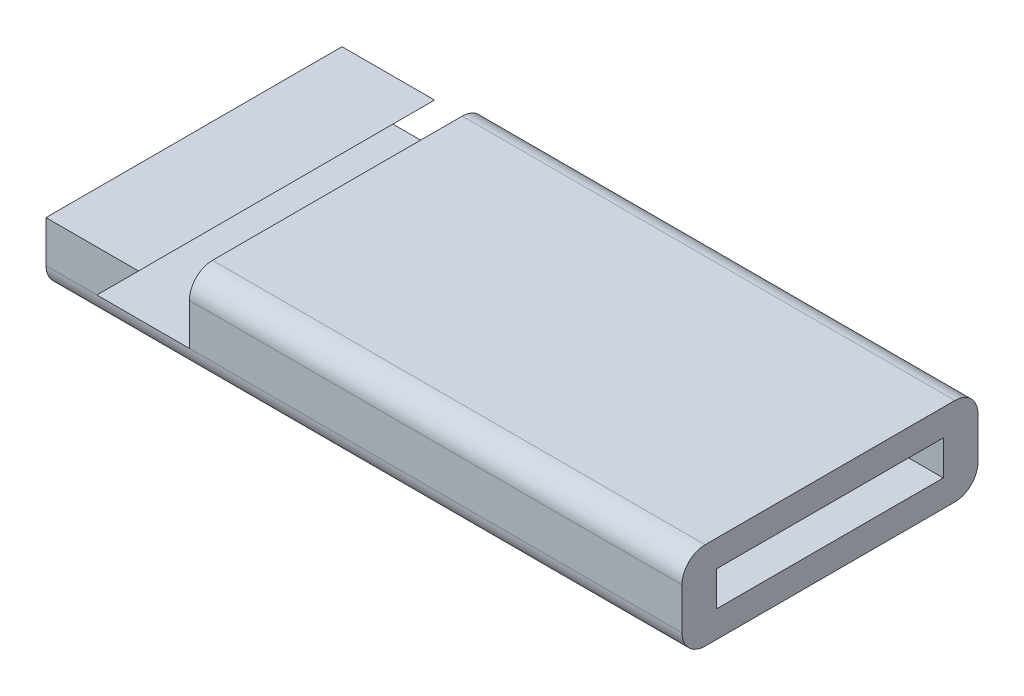
ISO-10303-21;
HEADER;
FILE_DESCRIPTION(('STEP AP214'),'2;1');
FILE_NAME('part.step','',(''),(''),'','','');
FILE_SCHEMA(('AUTOMOTIVE_DESIGN { 1 0 10303 214 1 1 1 1 }'));
ENDSEC;
DATA;
#1=APPLICATION_CONTEXT('core data for automotive mechanical design processes');
#2=APPLICATION_PROTOCOL_DEFINITION('international standard','automotive_design',2000,#1);
#3=PRODUCT_CONTEXT('',#1,'mechanical');
#4=PRODUCT('Part','Part','',(#3));
#5=PRODUCT_RELATED_PRODUCT_CATEGORY('part','',(#4));
#6=PRODUCT_DEFINITION_FORMATION('','',#4);
#7=PRODUCT_DEFINITION_CONTEXT('part definition',#1,'design');
#8=PRODUCT_DEFINITION('design','',#6,#7);
#9=PRODUCT_DEFINITION_SHAPE('','',#8);
#10=(LENGTH_UNIT() NAMED_UNIT(*) SI_UNIT(.MILLI.,.METRE.));
#11=(NAMED_UNIT(*) PLANE_ANGLE_UNIT() SI_UNIT($,.RADIAN.));
#12=(NAMED_UNIT(*) SI_UNIT($,.STERADIAN.) SOLID_ANGLE_UNIT());
#13=UNCERTAINTY_MEASURE_WITH_UNIT(LENGTH_MEASURE(1.E-05),#10,'distance_accuracy_value','');
#14=(GEOMETRIC_REPRESENTATION_CONTEXT(3) GLOBAL_UNCERTAINTY_ASSIGNED_CONTEXT((#13)) GLOBAL_UNIT_ASSIGNED_CONTEXT((#10,
#11,#12)) REPRESENTATION_CONTEXT('',''));
#15=CARTESIAN_POINT('',(0.,0.,0.));
#16=DIRECTION('',(0.,0.,1.));
#17=DIRECTION('',(1.,0.,0.));
#18=AXIS2_PLACEMENT_3D('',#15,#16,#17);
#19=CARTESIAN_POINT('',(0.,7.6,0.));
#20=DIRECTION('',(0.,0.,-1.));
#21=DIRECTION('',(-1.,0.,0.));
#22=AXIS2_PLACEMENT_3D('',#19,#20,#21);
#23=PLANE('',#22);
#24=DIRECTION('',(0.,-1.,0.));
#25=VECTOR('',#24,1.);
#26=CARTESIAN_POINT('',(0.,7.6,0.));
#27=LINE('',#26,#25);
#28=CARTESIAN_POINT('',(0.,5.6,0.));
#29=VERTEX_POINT('',#28);
#30=CARTESIAN_POINT('',(0.,2.,0.));
#31=VERTEX_POINT('',#30);
#32=EDGE_CURVE('E239',#29,#31,#27,.T.);
#33=ORIENTED_EDGE('',*,*,#32,.T.);
#34=DIRECTION('',(1.,0.,0.));
#35=VECTOR('',#34,1.);
#36=CARTESIAN_POINT('',(55.,2.,0.));
#37=LINE('',#36,#35);
#38=CARTESIAN_POINT('',(4.39999999999992,2.,0.));
#39=VERTEX_POINT('',#38);
#40=EDGE_CURVE('E269',#31,#39,#37,.T.);
#41=ORIENTED_EDGE('',*,*,#40,.T.);
#42=DIRECTION('',(-0.707106781186556,-0.707106781186539,0.));
#43=VECTOR('',#42,1.);
#44=CARTESIAN_POINT('',(1.1999999999999,-1.19999999999993,0.));
#45=LINE('',#44,#43);
#46=CARTESIAN_POINT('',(8.,5.6,0.));
#47=VERTEX_POINT('',#46);
#48=EDGE_CURVE('E193',#47,#39,#45,.T.);
#49=ORIENTED_EDGE('',*,*,#48,.F.);
#50=DIRECTION('',(1.,0.,0.));
#51=VECTOR('',#50,1.);
#52=CARTESIAN_POINT('',(0.,5.6,0.));
#53=LINE('',#52,#51);
#54=EDGE_CURVE('E196',#29,#47,#53,.T.);
#55=ORIENTED_EDGE('',*,*,#54,.F.);
#56=EDGE_LOOP('',(#33,#41,#49,#55));
#57=FACE_BOUND('',#56,.T.);
#58=ADVANCED_FACE('F37',(#57),#23,.F.);
#59=CARTESIAN_POINT('',(0.,7.6,-25.6));
#60=DIRECTION('',(0.,0.,1.));
#61=DIRECTION('',(1.,0.,0.));
#62=AXIS2_PLACEMENT_3D('',#59,#60,#61);
#63=PLANE('',#62);
#64=DIRECTION('',(0.,-1.,0.));
#65=VECTOR('',#64,1.);
#66=CARTESIAN_POINT('',(55.,7.6,-25.6));
#67=LINE('',#66,#65);
#68=CARTESIAN_POINT('',(55.,5.6,-25.6));
#69=VERTEX_POINT('',#68);
#70=CARTESIAN_POINT('',(55.,2.,-25.6));
#71=VERTEX_POINT('',#70);
#72=EDGE_CURVE('E233',#69,#71,#67,.T.);
#73=ORIENTED_EDGE('',*,*,#72,.T.);
#74=DIRECTION('',(-1.,0.,0.));
#75=VECTOR('',#74,1.);
#76=CARTESIAN_POINT('',(0.,2.,-25.6));
#77=LINE('',#76,#75);
#78=CARTESIAN_POINT('',(12.4,2.,-25.6));
#79=VERTEX_POINT('',#78);
#80=EDGE_CURVE('E246',#71,#79,#77,.T.);
#81=ORIENTED_EDGE('',*,*,#80,.T.);
#82=DIRECTION('',(0.,-1.,0.));
#83=VECTOR('',#82,1.);
#84=CARTESIAN_POINT('',(12.4,0.,-25.6));
#85=LINE('',#84,#83);
#86=CARTESIAN_POINT('',(12.4,5.6,-25.6));
#87=VERTEX_POINT('',#86);
#88=EDGE_CURVE('E184',#87,#79,#85,.T.);
#89=ORIENTED_EDGE('',*,*,#88,.F.);
#90=DIRECTION('',(-1.,0.,0.));
#91=VECTOR('',#90,1.);
#92=CARTESIAN_POINT('',(0.,5.6,-25.6));
#93=LINE('',#92,#91);
#94=EDGE_CURVE('E242',#87,#69,#93,.F.);
#95=ORIENTED_EDGE('',*,*,#94,.T.);
#96=EDGE_LOOP('',(#73,#81,#89,#95));
#97=FACE_BOUND('',#96,.T.);
#98=ADVANCED_FACE('F315',(#97),#63,.F.);
#99=CARTESIAN_POINT('',(0.,7.6,0.));
#100=DIRECTION('',(1.,0.,0.));
#101=DIRECTION('',(0.,0.,-1.));
#102=AXIS2_PLACEMENT_3D('',#99,#100,#101);
#103=PLANE('',#102);
#104=DIRECTION('',(0.,-1.,0.));
#105=VECTOR('',#104,1.);
#106=CARTESIAN_POINT('',(0.,7.6,-25.6));
#107=LINE('',#106,#105);
#108=CARTESIAN_POINT('',(0.,5.6,-25.6));
#109=VERTEX_POINT('',#108);
#110=CARTESIAN_POINT('',(0.,2.,-25.6));
#111=VERTEX_POINT('',#110);
#112=EDGE_CURVE('E225',#109,#111,#107,.T.);
#113=ORIENTED_EDGE('',*,*,#112,.T.);
#114=CARTESIAN_POINT('',(0.,2.,-23.6));
#115=DIRECTION('',(1.,0.,0.));
#116=DIRECTION('',(0.,0.,-1.));
#117=AXIS2_PLACEMENT_3D('',#114,#115,#116);
#118=CIRCLE('',#117,2.);
#119=CARTESIAN_POINT('',(0.,0.,-23.6));
#120=VERTEX_POINT('',#119);
#121=EDGE_CURVE('E251',#111,#120,#118,.F.);
#122=ORIENTED_EDGE('',*,*,#121,.T.);
#123=DIRECTION('',(0.,0.,1.));
#124=VECTOR('',#123,1.);
#125=CARTESIAN_POINT('',(0.,0.,0.));
#126=LINE('',#125,#124);
#127=CARTESIAN_POINT('',(0.,0.,-2.));
#128=VERTEX_POINT('',#127);
#129=EDGE_CURVE('E212',#120,#128,#126,.T.);
#130=ORIENTED_EDGE('',*,*,#129,.T.);
#131=CARTESIAN_POINT('',(0.,2.,-2.));
#132=DIRECTION('',(1.,0.,0.));
#133=DIRECTION('',(0.,0.,-1.));
#134=AXIS2_PLACEMENT_3D('',#131,#132,#133);
#135=CIRCLE('',#134,2.);
#136=EDGE_CURVE('E249',#128,#31,#135,.F.);
#137=ORIENTED_EDGE('',*,*,#136,.T.);
#138=ORIENTED_EDGE('',*,*,#32,.F.);
#139=DIRECTION('',(0.,0.,-1.));
#140=VECTOR('',#139,1.);
#141=CARTESIAN_POINT('',(0.,5.6,0.));
#142=LINE('',#141,#140);
#143=EDGE_CURVE('E209',#29,#109,#142,.T.);
#144=ORIENTED_EDGE('',*,*,#143,.T.);
#145=EDGE_LOOP('',(#113,#122,#130,#137,#138,#144));
#146=FACE_BOUND('',#145,.T.);
#147=ADVANCED_FACE('F330',(#146),#103,.F.);
#148=DIRECTION('',(0.,-1.,0.));
#149=VECTOR('',#148,1.);
#150=CARTESIAN_POINT('',(12.4,0.,0.));
#151=LINE('',#150,#149);
#152=CARTESIAN_POINT('',(12.4,5.6,0.));
#153=VERTEX_POINT('',#152);
#154=CARTESIAN_POINT('',(12.4,2.,0.));
#155=VERTEX_POINT('',#154);
#156=EDGE_CURVE('E188',#153,#155,#151,.T.);
#157=ORIENTED_EDGE('',*,*,#156,.T.);
#158=DIRECTION('',(1.,0.,0.));
#159=VECTOR('',#158,1.);
#160=CARTESIAN_POINT('',(55.,2.,0.));
#161=LINE('',#160,#159);
#162=CARTESIAN_POINT('',(55.,2.,0.));
#163=VERTEX_POINT('',#162);
#164=EDGE_CURVE('E267',#155,#163,#161,.T.);
#165=ORIENTED_EDGE('',*,*,#164,.T.);
#166=DIRECTION('',(0.,-1.,0.));
#167=VECTOR('',#166,1.);
#168=CARTESIAN_POINT('',(55.,7.6,0.));
#169=LINE('',#168,#167);
#170=CARTESIAN_POINT('',(55.,5.6,0.));
#171=VERTEX_POINT('',#170);
#172=EDGE_CURVE('E236',#171,#163,#169,.T.);
#173=ORIENTED_EDGE('',*,*,#172,.F.);
#174=DIRECTION('',(1.,0.,0.));
#175=VECTOR('',#174,1.);
#176=CARTESIAN_POINT('',(0.,5.6,0.));
#177=LINE('',#176,#175);
#178=EDGE_CURVE('E265',#171,#153,#177,.F.);
#179=ORIENTED_EDGE('',*,*,#178,.T.);
#180=EDGE_LOOP('',(#157,#165,#173,#179));
#181=FACE_BOUND('',#180,.T.);
#182=ADVANCED_FACE('F293',(#181),#23,.F.);
#183=DIRECTION('',(-0.707106781186556,-0.707106781186539,0.));
#184=VECTOR('',#183,1.);
#185=CARTESIAN_POINT('',(1.1999999999999,-1.19999999999993,-25.6));
#186=LINE('',#185,#184);
#187=CARTESIAN_POINT('',(8.,5.6,-25.6));
#188=VERTEX_POINT('',#187);
#189=CARTESIAN_POINT('',(4.39999999999992,2.,-25.6));
#190=VERTEX_POINT('',#189);
#191=EDGE_CURVE('E204',#188,#190,#186,.T.);
#192=ORIENTED_EDGE('',*,*,#191,.T.);
#193=DIRECTION('',(-1.,0.,0.));
#194=VECTOR('',#193,1.);
#195=CARTESIAN_POINT('',(0.,2.,-25.6));
#196=LINE('',#195,#194);
#197=EDGE_CURVE('E244',#190,#111,#196,.T.);
#198=ORIENTED_EDGE('',*,*,#197,.T.);
#199=ORIENTED_EDGE('',*,*,#112,.F.);
#200=DIRECTION('',(1.,0.,0.));
#201=VECTOR('',#200,1.);
#202=CARTESIAN_POINT('',(0.,5.6,-25.6));
#203=LINE('',#202,#201);
#204=EDGE_CURVE('E191',#109,#188,#203,.T.);
#205=ORIENTED_EDGE('',*,*,#204,.T.);
#206=EDGE_LOOP('',(#192,#198,#199,#205));
#207=FACE_BOUND('',#206,.T.);
#208=ADVANCED_FACE('F332',(#207),#63,.F.);
#209=CARTESIAN_POINT('',(55.,7.6,0.));
#210=DIRECTION('',(-1.,0.,0.));
#211=DIRECTION('',(0.,0.,1.));
#212=AXIS2_PLACEMENT_3D('',#209,#210,#211);
#213=PLANE('',#212);
#214=DIRECTION('',(0.,0.,-1.));
#215=VECTOR('',#214,1.);
#216=CARTESIAN_POINT('',(55.,2.3,-3.));
#217=LINE('',#216,#215);
#218=CARTESIAN_POINT('',(55.,2.3,-3.));
#219=VERTEX_POINT('',#218);
#220=CARTESIAN_POINT('',(55.,2.3,-22.6));
#221=VERTEX_POINT('',#220);
#222=EDGE_CURVE('E178',#219,#221,#217,.T.);
#223=ORIENTED_EDGE('',*,*,#222,.F.);
#224=DIRECTION('',(0.,-1.,0.));
#225=VECTOR('',#224,1.);
#226=CARTESIAN_POINT('',(55.,5.3,-3.));
#227=LINE('',#226,#225);
#228=CARTESIAN_POINT('',(55.,5.3,-3.));
#229=VERTEX_POINT('',#228);
#230=EDGE_CURVE('E52',#229,#219,#227,.T.);
#231=ORIENTED_EDGE('',*,*,#230,.F.);
#232=DIRECTION('',(0.,0.,1.));
#233=VECTOR('',#232,1.);
#234=CARTESIAN_POINT('',(55.,5.3,-3.));
#235=LINE('',#234,#233);
#236=CARTESIAN_POINT('',(55.,5.3,-22.6));
#237=VERTEX_POINT('',#236);
#238=EDGE_CURVE('E169',#237,#229,#235,.T.);
#239=ORIENTED_EDGE('',*,*,#238,.F.);
#240=DIRECTION('',(0.,1.,0.));
#241=VECTOR('',#240,1.);
#242=CARTESIAN_POINT('',(55.,5.3,-22.6));
#243=LINE('',#242,#241);
#244=EDGE_CURVE('E172',#221,#237,#243,.T.);
#245=ORIENTED_EDGE('',*,*,#244,.F.);
#246=EDGE_LOOP('',(#223,#231,#239,#245));
#247=FACE_BOUND('',#246,.T.);
#248=DIRECTION('',(0.,0.,-1.));
#249=VECTOR('',#248,1.);
#250=CARTESIAN_POINT('',(55.,0.,0.));
#251=LINE('',#250,#249);
#252=CARTESIAN_POINT('',(55.,0.,-2.));
#253=VERTEX_POINT('',#252);
#254=CARTESIAN_POINT('',(55.,0.,-23.6));
#255=VERTEX_POINT('',#254);
#256=EDGE_CURVE('E226',#253,#255,#251,.T.);
#257=ORIENTED_EDGE('',*,*,#256,.T.);
#258=CARTESIAN_POINT('',(55.,2.,-23.6));
#259=DIRECTION('',(-1.,0.,0.));
#260=DIRECTION('',(0.,0.,1.));
#261=AXIS2_PLACEMENT_3D('',#258,#259,#260);
#262=CIRCLE('',#261,2.);
#263=EDGE_CURVE('E263',#255,#71,#262,.F.);
#264=ORIENTED_EDGE('',*,*,#263,.T.);
#265=ORIENTED_EDGE('',*,*,#72,.F.);
#266=CARTESIAN_POINT('',(55.,5.6,-23.6));
#267=DIRECTION('',(-1.,0.,0.));
#268=DIRECTION('',(0.,0.,1.));
#269=AXIS2_PLACEMENT_3D('',#266,#267,#268);
#270=CIRCLE('',#269,2.);
#271=CARTESIAN_POINT('',(55.,7.6,-23.6));
#272=VERTEX_POINT('',#271);
#273=EDGE_CURVE('E259',#69,#272,#270,.F.);
#274=ORIENTED_EDGE('',*,*,#273,.T.);
#275=DIRECTION('',(0.,0.,-1.));
#276=VECTOR('',#275,1.);
#277=CARTESIAN_POINT('',(55.,7.6,0.));
#278=LINE('',#277,#276);
#279=CARTESIAN_POINT('',(55.,7.6,-2.));
#280=VERTEX_POINT('',#279);
#281=EDGE_CURVE('E222',#280,#272,#278,.T.);
#282=ORIENTED_EDGE('',*,*,#281,.F.);
#283=CARTESIAN_POINT('',(55.,5.6,-2.));
#284=DIRECTION('',(-1.,0.,0.));
#285=DIRECTION('',(0.,0.,1.));
#286=AXIS2_PLACEMENT_3D('',#283,#284,#285);
#287=CIRCLE('',#286,2.);
#288=EDGE_CURVE('E257',#280,#171,#287,.F.);
#289=ORIENTED_EDGE('',*,*,#288,.T.);
#290=ORIENTED_EDGE('',*,*,#172,.T.);
#291=CARTESIAN_POINT('',(55.,2.,-2.));
#292=DIRECTION('',(-1.,0.,0.));
#293=DIRECTION('',(0.,0.,1.));
#294=AXIS2_PLACEMENT_3D('',#291,#292,#293);
#295=CIRCLE('',#294,2.);
#296=EDGE_CURVE('E261',#163,#253,#295,.F.);
#297=ORIENTED_EDGE('',*,*,#296,.T.);
#298=EDGE_LOOP('',(#257,#264,#265,#274,#282,#289,#290,#297));
#299=FACE_BOUND('',#298,.T.);
#300=ADVANCED_FACE('F290',(#247,#299),#213,.F.);
#301=CARTESIAN_POINT('',(0.,7.6,0.));
#302=DIRECTION('',(0.,-1.,0.));
#303=DIRECTION('',(0.,0.,-1.));
#304=AXIS2_PLACEMENT_3D('',#301,#302,#303);
#305=PLANE('',#304);
#306=ORIENTED_EDGE('',*,*,#281,.T.);
#307=DIRECTION('',(-1.,0.,0.));
#308=VECTOR('',#307,1.);
#309=CARTESIAN_POINT('',(0.,7.6,-23.6));
#310=LINE('',#309,#308);
#311=CARTESIAN_POINT('',(12.4,7.6,-23.6));
#312=VERTEX_POINT('',#311);
#313=EDGE_CURVE('E275',#272,#312,#310,.T.);
#314=ORIENTED_EDGE('',*,*,#313,.T.);
#315=DIRECTION('',(0.,0.,-1.));
#316=VECTOR('',#315,1.);
#317=CARTESIAN_POINT('',(12.4,7.6,0.));
#318=LINE('',#317,#316);
#319=CARTESIAN_POINT('',(12.4,7.6,-2.));
#320=VERTEX_POINT('',#319);
#321=EDGE_CURVE('E198',#320,#312,#318,.T.);
#322=ORIENTED_EDGE('',*,*,#321,.F.);
#323=DIRECTION('',(1.,0.,0.));
#324=VECTOR('',#323,1.);
#325=CARTESIAN_POINT('',(0.,7.6,-2.));
#326=LINE('',#325,#324);
#327=EDGE_CURVE('E272',#320,#280,#326,.T.);
#328=ORIENTED_EDGE('',*,*,#327,.T.);
#329=EDGE_LOOP('',(#306,#314,#322,#328));
#330=FACE_BOUND('',#329,.T.);
#331=ADVANCED_FACE('F286',(#330),#305,.F.);
#332=CARTESIAN_POINT('',(0.,0.,0.));
#333=DIRECTION('',(0.,-1.,0.));
#334=DIRECTION('',(0.,0.,-1.));
#335=AXIS2_PLACEMENT_3D('',#332,#333,#334);
#336=PLANE('',#335);
#337=ORIENTED_EDGE('',*,*,#129,.F.);
#338=DIRECTION('',(-1.,0.,0.));
#339=VECTOR('',#338,1.);
#340=CARTESIAN_POINT('',(55.,0.,-23.6));
#341=LINE('',#340,#339);
#342=EDGE_CURVE('E255',#120,#255,#341,.F.);
#343=ORIENTED_EDGE('',*,*,#342,.T.);
#344=ORIENTED_EDGE('',*,*,#256,.F.);
#345=DIRECTION('',(1.,0.,0.));
#346=VECTOR('',#345,1.);
#347=CARTESIAN_POINT('',(0.,0.,-2.));
#348=LINE('',#347,#346);
#349=EDGE_CURVE('E253',#253,#128,#348,.F.);
#350=ORIENTED_EDGE('',*,*,#349,.T.);
#351=EDGE_LOOP('',(#337,#343,#344,#350));
#352=FACE_BOUND('',#351,.T.);
#353=ADVANCED_FACE('F305',(#352),#336,.T.);
#354=CARTESIAN_POINT('',(0.,5.6,0.));
#355=DIRECTION('',(0.,1.,0.));
#356=DIRECTION('',(-1.,0.,0.));
#357=AXIS2_PLACEMENT_3D('',#354,#355,#356);
#358=PLANE('',#357);
#359=ORIENTED_EDGE('',*,*,#204,.F.);
#360=ORIENTED_EDGE('',*,*,#143,.F.);
#361=ORIENTED_EDGE('',*,*,#54,.T.);
#362=DIRECTION('',(0.,0.,-1.));
#363=VECTOR('',#362,1.);
#364=CARTESIAN_POINT('',(8.,5.6,0.));
#365=LINE('',#364,#363);
#366=EDGE_CURVE('E213',#47,#188,#365,.T.);
#367=ORIENTED_EDGE('',*,*,#366,.T.);
#368=EDGE_LOOP('',(#359,#360,#361,#367));
#369=FACE_BOUND('',#368,.T.);
#370=ADVANCED_FACE('F362',(#369),#358,.T.);
#371=CARTESIAN_POINT('',(1.1999999999999,-1.19999999999993,0.));
#372=DIRECTION('',(0.707106781186539,-0.707106781186556,0.));
#373=DIRECTION('',(0.707106781186556,0.707106781186539,0.));
#374=AXIS2_PLACEMENT_3D('',#371,#372,#373);
#375=PLANE('',#374);
#376=ORIENTED_EDGE('',*,*,#191,.F.);
#377=ORIENTED_EDGE('',*,*,#366,.F.);
#378=ORIENTED_EDGE('',*,*,#48,.T.);
#379=DIRECTION('',(0.,0.,-1.));
#380=VECTOR('',#379,1.);
#381=CARTESIAN_POINT('',(4.39999999999992,2.,0.));
#382=LINE('',#381,#380);
#383=EDGE_CURVE('E215',#39,#190,#382,.T.);
#384=ORIENTED_EDGE('',*,*,#383,.T.);
#385=EDGE_LOOP('',(#376,#377,#378,#384));
#386=FACE_BOUND('',#385,.T.);
#387=ADVANCED_FACE('F354',(#386),#375,.T.);
#388=CARTESIAN_POINT('',(0.,2.,0.));
#389=DIRECTION('',(0.,-1.,0.));
#390=DIRECTION('',(0.,0.,-1.));
#391=AXIS2_PLACEMENT_3D('',#388,#389,#390);
#392=PLANE('',#391);
#393=DIRECTION('',(-1.,0.,0.));
#394=VECTOR('',#393,1.);
#395=CARTESIAN_POINT('',(0.,2.,-25.6));
#396=LINE('',#395,#394);
#397=EDGE_CURVE('E201',#79,#190,#396,.T.);
#398=ORIENTED_EDGE('',*,*,#397,.T.);
#399=ORIENTED_EDGE('',*,*,#383,.F.);
#400=DIRECTION('',(-1.,0.,0.));
#401=VECTOR('',#400,1.);
#402=CARTESIAN_POINT('',(0.,2.,0.));
#403=LINE('',#402,#401);
#404=EDGE_CURVE('E190',#155,#39,#403,.T.);
#405=ORIENTED_EDGE('',*,*,#404,.F.);
#406=DIRECTION('',(0.,0.,-1.));
#407=VECTOR('',#406,1.);
#408=CARTESIAN_POINT('',(12.4,2.,0.));
#409=LINE('',#408,#407);
#410=EDGE_CURVE('E217',#155,#79,#409,.T.);
#411=ORIENTED_EDGE('',*,*,#410,.T.);
#412=EDGE_LOOP('',(#398,#399,#405,#411));
#413=FACE_BOUND('',#412,.T.);
#414=ADVANCED_FACE('F349',(#413),#392,.F.);
#415=CARTESIAN_POINT('',(12.4,0.,0.));
#416=DIRECTION('',(1.,0.,0.));
#417=DIRECTION('',(0.,1.,0.));
#418=AXIS2_PLACEMENT_3D('',#415,#416,#417);
#419=PLANE('',#418);
#420=ORIENTED_EDGE('',*,*,#321,.T.);
#421=CARTESIAN_POINT('',(12.4,5.6,-23.6));
#422=DIRECTION('',(1.,0.,0.));
#423=DIRECTION('',(0.,1.,0.));
#424=AXIS2_PLACEMENT_3D('',#421,#422,#423);
#425=CIRCLE('',#424,2.);
#426=EDGE_CURVE('E11',#312,#87,#425,.F.);
#427=ORIENTED_EDGE('',*,*,#426,.T.);
#428=ORIENTED_EDGE('',*,*,#88,.T.);
#429=ORIENTED_EDGE('',*,*,#410,.F.);
#430=ORIENTED_EDGE('',*,*,#156,.F.);
#431=CARTESIAN_POINT('',(12.4,5.6,-2.));
#432=DIRECTION('',(1.,0.,0.));
#433=DIRECTION('',(0.,1.,0.));
#434=AXIS2_PLACEMENT_3D('',#431,#432,#433);
#435=CIRCLE('',#434,2.);
#436=EDGE_CURVE('E45',#153,#320,#435,.F.);
#437=ORIENTED_EDGE('',*,*,#436,.T.);
#438=EDGE_LOOP('',(#420,#427,#428,#429,#430,#437));
#439=FACE_BOUND('',#438,.T.);
#440=ADVANCED_FACE('F280',(#439),#419,.F.);
#441=CARTESIAN_POINT('',(0.,2.,-23.6));
#442=DIRECTION('',(1.,0.,0.));
#443=DIRECTION('',(0.,0.,-1.));
#444=AXIS2_PLACEMENT_3D('',#441,#442,#443);
#445=CYLINDRICAL_SURFACE('',#444,2.);
#446=ORIENTED_EDGE('',*,*,#263,.F.);
#447=ORIENTED_EDGE('',*,*,#342,.F.);
#448=ORIENTED_EDGE('',*,*,#121,.F.);
#449=ORIENTED_EDGE('',*,*,#197,.F.);
#450=ORIENTED_EDGE('',*,*,#397,.F.);
#451=ORIENTED_EDGE('',*,*,#80,.F.);
#452=EDGE_LOOP('',(#446,#447,#448,#449,#450,#451));
#453=FACE_BOUND('',#452,.T.);
#454=ADVANCED_FACE('F309',(#453),#445,.T.);
#455=CARTESIAN_POINT('',(0.,2.,-2.));
#456=DIRECTION('',(-1.,0.,0.));
#457=DIRECTION('',(0.,0.,1.));
#458=AXIS2_PLACEMENT_3D('',#455,#456,#457);
#459=CYLINDRICAL_SURFACE('',#458,2.);
#460=ORIENTED_EDGE('',*,*,#136,.F.);
#461=ORIENTED_EDGE('',*,*,#349,.F.);
#462=ORIENTED_EDGE('',*,*,#296,.F.);
#463=ORIENTED_EDGE('',*,*,#164,.F.);
#464=ORIENTED_EDGE('',*,*,#404,.T.);
#465=ORIENTED_EDGE('',*,*,#40,.F.);
#466=EDGE_LOOP('',(#460,#461,#462,#463,#464,#465));
#467=FACE_BOUND('',#466,.T.);
#468=ADVANCED_FACE('F297',(#467),#459,.T.);
#469=CARTESIAN_POINT('',(0.,5.6,-23.6));
#470=DIRECTION('',(-1.,0.,0.));
#471=DIRECTION('',(0.,0.,1.));
#472=AXIS2_PLACEMENT_3D('',#469,#470,#471);
#473=CYLINDRICAL_SURFACE('',#472,2.);
#474=ORIENTED_EDGE('',*,*,#273,.F.);
#475=ORIENTED_EDGE('',*,*,#94,.F.);
#476=ORIENTED_EDGE('',*,*,#426,.F.);
#477=ORIENTED_EDGE('',*,*,#313,.F.);
#478=EDGE_LOOP('',(#474,#475,#476,#477));
#479=FACE_BOUND('',#478,.T.);
#480=ADVANCED_FACE('F317',(#479),#473,.T.);
#481=CARTESIAN_POINT('',(0.,5.6,-2.));
#482=DIRECTION('',(1.,0.,0.));
#483=DIRECTION('',(0.,0.,-1.));
#484=AXIS2_PLACEMENT_3D('',#481,#482,#483);
#485=CYLINDRICAL_SURFACE('',#484,2.);
#486=ORIENTED_EDGE('',*,*,#436,.F.);
#487=ORIENTED_EDGE('',*,*,#178,.F.);
#488=ORIENTED_EDGE('',*,*,#288,.F.);
#489=ORIENTED_EDGE('',*,*,#327,.F.);
#490=EDGE_LOOP('',(#486,#487,#488,#489));
#491=FACE_BOUND('',#490,.T.);
#492=ADVANCED_FACE('F39',(#491),#485,.T.);
#493=CARTESIAN_POINT('',(45.,5.3,-3.));
#494=DIRECTION('',(0.,0.,1.));
#495=DIRECTION('',(0.,-1.,0.));
#496=AXIS2_PLACEMENT_3D('',#493,#494,#495);
#497=PLANE('',#496);
#498=ORIENTED_EDGE('',*,*,#230,.T.);
#499=DIRECTION('',(1.,0.,0.));
#500=VECTOR('',#499,1.);
#501=CARTESIAN_POINT('',(45.,2.3,-3.));
#502=LINE('',#501,#500);
#503=CARTESIAN_POINT('',(45.,2.3,-3.));
#504=VERTEX_POINT('',#503);
#505=EDGE_CURVE('E147',#504,#219,#502,.T.);
#506=ORIENTED_EDGE('',*,*,#505,.F.);
#507=DIRECTION('',(0.,-1.,0.));
#508=VECTOR('',#507,1.);
#509=CARTESIAN_POINT('',(45.,5.3,-3.));
#510=LINE('',#509,#508);
#511=CARTESIAN_POINT('',(45.,5.3,-3.));
#512=VERTEX_POINT('',#511);
#513=EDGE_CURVE('E151',#512,#504,#510,.T.);
#514=ORIENTED_EDGE('',*,*,#513,.F.);
#515=DIRECTION('',(1.,0.,0.));
#516=VECTOR('',#515,1.);
#517=CARTESIAN_POINT('',(45.,5.3,-3.));
#518=LINE('',#517,#516);
#519=EDGE_CURVE('E182',#512,#229,#518,.T.);
#520=ORIENTED_EDGE('',*,*,#519,.T.);
#521=EDGE_LOOP('',(#498,#506,#514,#520));
#522=FACE_BOUND('',#521,.T.);
#523=ADVANCED_FACE('F149',(#522),#497,.F.);
#524=CARTESIAN_POINT('',(45.,5.3,-3.));
#525=DIRECTION('',(0.,1.,0.));
#526=DIRECTION('',(0.,0.,1.));
#527=AXIS2_PLACEMENT_3D('',#524,#525,#526);
#528=PLANE('',#527);
#529=ORIENTED_EDGE('',*,*,#238,.T.);
#530=ORIENTED_EDGE('',*,*,#519,.F.);
#531=DIRECTION('',(0.,0.,1.));
#532=VECTOR('',#531,1.);
#533=CARTESIAN_POINT('',(45.,5.3,-3.));
#534=LINE('',#533,#532);
#535=CARTESIAN_POINT('',(45.,5.3,-22.6));
#536=VERTEX_POINT('',#535);
#537=EDGE_CURVE('E157',#536,#512,#534,.T.);
#538=ORIENTED_EDGE('',*,*,#537,.F.);
#539=DIRECTION('',(1.,0.,0.));
#540=VECTOR('',#539,1.);
#541=CARTESIAN_POINT('',(45.,5.3,-22.6));
#542=LINE('',#541,#540);
#543=EDGE_CURVE('E185',#536,#237,#542,.T.);
#544=ORIENTED_EDGE('',*,*,#543,.T.);
#545=EDGE_LOOP('',(#529,#530,#538,#544));
#546=FACE_BOUND('',#545,.T.);
#547=ADVANCED_FACE('F372',(#546),#528,.F.);
#548=CARTESIAN_POINT('',(45.,5.3,-22.6));
#549=DIRECTION('',(0.,0.,-1.));
#550=DIRECTION('',(-1.,0.,0.));
#551=AXIS2_PLACEMENT_3D('',#548,#549,#550);
#552=PLANE('',#551);
#553=ORIENTED_EDGE('',*,*,#244,.T.);
#554=ORIENTED_EDGE('',*,*,#543,.F.);
#555=DIRECTION('',(0.,1.,0.));
#556=VECTOR('',#555,1.);
#557=CARTESIAN_POINT('',(45.,5.3,-22.6));
#558=LINE('',#557,#556);
#559=CARTESIAN_POINT('',(45.,2.3,-22.6));
#560=VERTEX_POINT('',#559);
#561=EDGE_CURVE('E165',#560,#536,#558,.T.);
#562=ORIENTED_EDGE('',*,*,#561,.F.);
#563=DIRECTION('',(1.,0.,0.));
#564=VECTOR('',#563,1.);
#565=CARTESIAN_POINT('',(45.,2.3,-22.6));
#566=LINE('',#565,#564);
#567=EDGE_CURVE('E156',#560,#221,#566,.T.);
#568=ORIENTED_EDGE('',*,*,#567,.T.);
#569=EDGE_LOOP('',(#553,#554,#562,#568));
#570=FACE_BOUND('',#569,.T.);
#571=ADVANCED_FACE('F370',(#570),#552,.F.);
#572=CARTESIAN_POINT('',(45.,2.3,-3.));
#573=DIRECTION('',(0.,-1.,0.));
#574=DIRECTION('',(0.,0.,-1.));
#575=AXIS2_PLACEMENT_3D('',#572,#573,#574);
#576=PLANE('',#575);
#577=ORIENTED_EDGE('',*,*,#222,.T.);
#578=ORIENTED_EDGE('',*,*,#567,.F.);
#579=DIRECTION('',(0.,0.,-1.));
#580=VECTOR('',#579,1.);
#581=CARTESIAN_POINT('',(45.,2.3,-3.));
#582=LINE('',#581,#580);
#583=EDGE_CURVE('E160',#504,#560,#582,.T.);
#584=ORIENTED_EDGE('',*,*,#583,.F.);
#585=ORIENTED_EDGE('',*,*,#505,.T.);
#586=EDGE_LOOP('',(#577,#578,#584,#585));
#587=FACE_BOUND('',#586,.T.);
#588=ADVANCED_FACE('F161',(#587),#576,.F.);
#589=CARTESIAN_POINT('',(45.,0.,0.));
#590=DIRECTION('',(1.,0.,0.));
#591=DIRECTION('',(0.,0.,-1.));
#592=AXIS2_PLACEMENT_3D('',#589,#590,#591);
#593=PLANE('',#592);
#594=ORIENTED_EDGE('',*,*,#513,.T.);
#595=ORIENTED_EDGE('',*,*,#583,.T.);
#596=ORIENTED_EDGE('',*,*,#561,.T.);
#597=ORIENTED_EDGE('',*,*,#537,.T.);
#598=EDGE_LOOP('',(#594,#595,#596,#597));
#599=FACE_BOUND('',#598,.T.);
#600=ADVANCED_FACE('F167',(#599),#593,.T.);
#601=CLOSED_SHELL('',(#58,#98,#147,#182,#208,#300,#331,#353,#370,#387,#414,#440,#454,#468,#480,
#492,#523,#547,#571,#588,#600));
#602=MANIFOLD_SOLID_BREP('B2',#601);
#603=ADVANCED_BREP_SHAPE_REPRESENTATION('',(#18,#602),#14);
#604=SHAPE_DEFINITION_REPRESENTATION(#9,#603);
ENDSEC;
END-ISO-10303-21;
